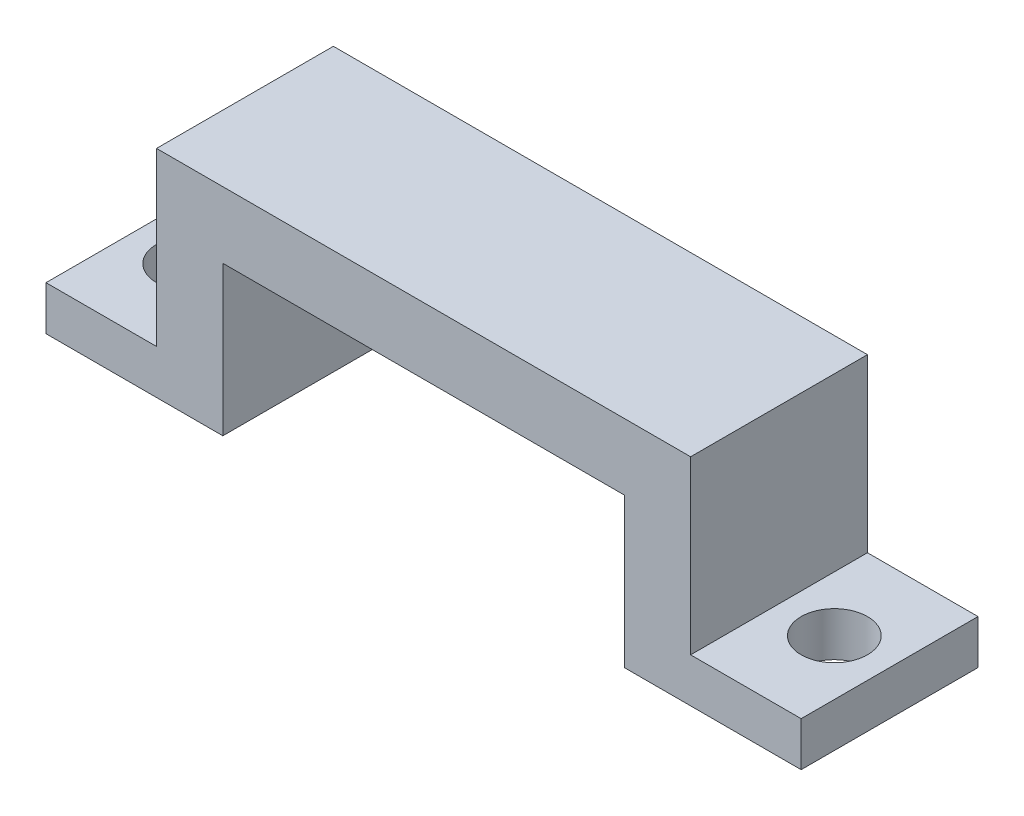
ISO-10303-21;
HEADER;
FILE_DESCRIPTION(('STEP AP214'),'2;1');
FILE_NAME('part.step','',(''),(''),'','','');
FILE_SCHEMA(('AUTOMOTIVE_DESIGN { 1 0 10303 214 1 1 1 1 }'));
ENDSEC;
DATA;
#1=APPLICATION_CONTEXT('core data for automotive mechanical design processes');
#2=APPLICATION_PROTOCOL_DEFINITION('international standard','automotive_design',2000,#1);
#3=PRODUCT_CONTEXT('',#1,'mechanical');
#4=PRODUCT('Part','Part','',(#3));
#5=PRODUCT_RELATED_PRODUCT_CATEGORY('part','',(#4));
#6=PRODUCT_DEFINITION_FORMATION('','',#4);
#7=PRODUCT_DEFINITION_CONTEXT('part definition',#1,'design');
#8=PRODUCT_DEFINITION('design','',#6,#7);
#9=PRODUCT_DEFINITION_SHAPE('','',#8);
#10=(LENGTH_UNIT() NAMED_UNIT(*) SI_UNIT(.MILLI.,.METRE.));
#11=(NAMED_UNIT(*) PLANE_ANGLE_UNIT() SI_UNIT($,.RADIAN.));
#12=(NAMED_UNIT(*) SI_UNIT($,.STERADIAN.) SOLID_ANGLE_UNIT());
#13=UNCERTAINTY_MEASURE_WITH_UNIT(LENGTH_MEASURE(1.E-05),#10,'distance_accuracy_value','');
#14=(GEOMETRIC_REPRESENTATION_CONTEXT(3) GLOBAL_UNCERTAINTY_ASSIGNED_CONTEXT((#13)) GLOBAL_UNIT_ASSIGNED_CONTEXT((#10,
#11,#12)) REPRESENTATION_CONTEXT('',''));
#15=CARTESIAN_POINT('',(0.,0.,0.));
#16=DIRECTION('',(0.,0.,1.));
#17=DIRECTION('',(1.,0.,0.));
#18=AXIS2_PLACEMENT_3D('',#15,#16,#17);
#19=CARTESIAN_POINT('',(0.,-1.38,8.));
#20=DIRECTION('',(0.,-1.,0.));
#21=DIRECTION('',(1.,0.,0.));
#22=AXIS2_PLACEMENT_3D('',#19,#20,#21);
#23=PLANE('',#22);
#24=DIRECTION('',(-1.,0.,0.));
#25=VECTOR('',#24,1.);
#26=CARTESIAN_POINT('',(0.,-1.38,0.));
#27=LINE('',#26,#25);
#28=CARTESIAN_POINT('',(-12.23,-1.38,0.));
#29=VERTEX_POINT('',#28);
#30=CARTESIAN_POINT('',(-17.23,-1.38,0.));
#31=VERTEX_POINT('',#30);
#32=EDGE_CURVE('E181',#29,#31,#27,.T.);
#33=ORIENTED_EDGE('',*,*,#32,.T.);
#34=DIRECTION('',(0.,0.,-1.));
#35=VECTOR('',#34,1.);
#36=CARTESIAN_POINT('',(-17.23,-1.38,8.));
#37=LINE('',#36,#35);
#38=CARTESIAN_POINT('',(-17.23,-1.38,8.));
#39=VERTEX_POINT('',#38);
#40=EDGE_CURVE('E202',#39,#31,#37,.T.);
#41=ORIENTED_EDGE('',*,*,#40,.F.);
#42=DIRECTION('',(-1.,0.,0.));
#43=VECTOR('',#42,1.);
#44=CARTESIAN_POINT('',(0.,-1.38,8.));
#45=LINE('',#44,#43);
#46=CARTESIAN_POINT('',(-12.23,-1.38,8.));
#47=VERTEX_POINT('',#46);
#48=EDGE_CURVE('E240',#47,#39,#45,.T.);
#49=ORIENTED_EDGE('',*,*,#48,.F.);
#50=DIRECTION('',(0.,0.,-1.));
#51=VECTOR('',#50,1.);
#52=CARTESIAN_POINT('',(-12.23,-1.38,8.));
#53=LINE('',#52,#51);
#54=EDGE_CURVE('E204',#47,#29,#53,.T.);
#55=ORIENTED_EDGE('',*,*,#54,.T.);
#56=EDGE_LOOP('',(#33,#41,#49,#55));
#57=FACE_BOUND('',#56,.T.);
#58=CARTESIAN_POINT('',(-14.73,-1.38,4.));
#59=DIRECTION('',(0.,1.,0.));
#60=DIRECTION('',(0.,0.,1.));
#61=AXIS2_PLACEMENT_3D('',#58,#59,#60);
#62=CIRCLE('',#61,1.49999999999999);
#63=CARTESIAN_POINT('',(-14.73,-1.38,5.49999999999999));
#64=VERTEX_POINT('',#63);
#65=EDGE_CURVE('E296',#64,#64,#62,.T.);
#66=ORIENTED_EDGE('',*,*,#65,.F.);
#67=EDGE_LOOP('',(#66));
#68=FACE_BOUND('',#67,.T.);
#69=ADVANCED_FACE('F41',(#57,#68),#23,.F.);
#70=CARTESIAN_POINT('',(0.,-3.38,8.));
#71=DIRECTION('',(0.,-1.,0.));
#72=DIRECTION('',(0.,0.,-1.));
#73=AXIS2_PLACEMENT_3D('',#70,#71,#72);
#74=PLANE('',#73);
#75=DIRECTION('',(-1.,0.,0.));
#76=VECTOR('',#75,1.);
#77=CARTESIAN_POINT('',(0.,-3.38,0.));
#78=LINE('',#77,#76);
#79=CARTESIAN_POINT('',(-9.23,-3.38,0.));
#80=VERTEX_POINT('',#79);
#81=CARTESIAN_POINT('',(-17.23,-3.38,0.));
#82=VERTEX_POINT('',#81);
#83=EDGE_CURVE('E187',#80,#82,#78,.T.);
#84=ORIENTED_EDGE('',*,*,#83,.F.);
#85=DIRECTION('',(0.,0.,-1.));
#86=VECTOR('',#85,1.);
#87=CARTESIAN_POINT('',(-9.23,-3.38,8.));
#88=LINE('',#87,#86);
#89=CARTESIAN_POINT('',(-9.23,-3.38,8.));
#90=VERTEX_POINT('',#89);
#91=EDGE_CURVE('E155',#90,#80,#88,.T.);
#92=ORIENTED_EDGE('',*,*,#91,.F.);
#93=DIRECTION('',(-1.,0.,0.));
#94=VECTOR('',#93,1.);
#95=CARTESIAN_POINT('',(0.,-3.38,8.));
#96=LINE('',#95,#94);
#97=CARTESIAN_POINT('',(-17.23,-3.38,8.));
#98=VERTEX_POINT('',#97);
#99=EDGE_CURVE('E145',#90,#98,#96,.T.);
#100=ORIENTED_EDGE('',*,*,#99,.T.);
#101=DIRECTION('',(0.,0.,-1.));
#102=VECTOR('',#101,1.);
#103=CARTESIAN_POINT('',(-17.23,-3.38,8.));
#104=LINE('',#103,#102);
#105=EDGE_CURVE('E200',#98,#82,#104,.T.);
#106=ORIENTED_EDGE('',*,*,#105,.T.);
#107=EDGE_LOOP('',(#84,#92,#100,#106));
#108=FACE_BOUND('',#107,.T.);
#109=CARTESIAN_POINT('',(-14.73,-3.38,4.));
#110=DIRECTION('',(0.,1.,0.));
#111=DIRECTION('',(0.,0.,1.));
#112=AXIS2_PLACEMENT_3D('',#109,#110,#111);
#113=CIRCLE('',#112,1.5);
#114=CARTESIAN_POINT('',(-14.73,-3.38,5.5));
#115=VERTEX_POINT('',#114);
#116=EDGE_CURVE('E166',#115,#115,#113,.T.);
#117=ORIENTED_EDGE('',*,*,#116,.T.);
#118=EDGE_LOOP('',(#117));
#119=FACE_BOUND('',#118,.T.);
#120=ADVANCED_FACE('F246',(#108,#119),#74,.T.);
#121=CARTESIAN_POINT('',(0.,-3.38000000000001,8.));
#122=DIRECTION('',(0.,1.,0.));
#123=DIRECTION('',(-1.,0.,0.));
#124=AXIS2_PLACEMENT_3D('',#121,#122,#123);
#125=PLANE('',#124);
#126=CARTESIAN_POINT('',(14.43,-3.38,4.));
#127=DIRECTION('',(0.,1.,0.));
#128=DIRECTION('',(0.,0.,1.));
#129=AXIS2_PLACEMENT_3D('',#126,#127,#128);
#130=CIRCLE('',#129,1.5);
#131=CARTESIAN_POINT('',(14.43,-3.38,5.5));
#132=VERTEX_POINT('',#131);
#133=EDGE_CURVE('E292',#132,#132,#130,.T.);
#134=ORIENTED_EDGE('',*,*,#133,.T.);
#135=EDGE_LOOP('',(#134));
#136=FACE_BOUND('',#135,.T.);
#137=DIRECTION('',(1.,0.,0.));
#138=VECTOR('',#137,1.);
#139=CARTESIAN_POINT('',(0.,-3.38000000000001,0.));
#140=LINE('',#139,#138);
#141=CARTESIAN_POINT('',(8.93,-3.38,0.));
#142=VERTEX_POINT('',#141);
#143=CARTESIAN_POINT('',(16.93,-3.38,0.));
#144=VERTEX_POINT('',#143);
#145=EDGE_CURVE('E163',#142,#144,#140,.T.);
#146=ORIENTED_EDGE('',*,*,#145,.T.);
#147=DIRECTION('',(0.,0.,-1.));
#148=VECTOR('',#147,1.);
#149=CARTESIAN_POINT('',(16.93,-3.38,8.));
#150=LINE('',#149,#148);
#151=CARTESIAN_POINT('',(16.93,-3.38,8.));
#152=VERTEX_POINT('',#151);
#153=EDGE_CURVE('E11',#152,#144,#150,.T.);
#154=ORIENTED_EDGE('',*,*,#153,.F.);
#155=DIRECTION('',(1.,0.,0.));
#156=VECTOR('',#155,1.);
#157=CARTESIAN_POINT('',(0.,-3.38000000000001,8.));
#158=LINE('',#157,#156);
#159=CARTESIAN_POINT('',(8.93,-3.38,8.));
#160=VERTEX_POINT('',#159);
#161=EDGE_CURVE('E196',#160,#152,#158,.T.);
#162=ORIENTED_EDGE('',*,*,#161,.F.);
#163=DIRECTION('',(0.,0.,-1.));
#164=VECTOR('',#163,1.);
#165=CARTESIAN_POINT('',(8.93,-3.38,8.));
#166=LINE('',#165,#164);
#167=EDGE_CURVE('E58',#160,#142,#166,.T.);
#168=ORIENTED_EDGE('',*,*,#167,.T.);
#169=EDGE_LOOP('',(#146,#154,#162,#168));
#170=FACE_BOUND('',#169,.T.);
#171=ADVANCED_FACE('F43',(#136,#170),#125,.F.);
#172=CARTESIAN_POINT('',(16.93,0.,8.));
#173=DIRECTION('',(-1.,0.,0.));
#174=DIRECTION('',(0.,0.,1.));
#175=AXIS2_PLACEMENT_3D('',#172,#173,#174);
#176=PLANE('',#175);
#177=DIRECTION('',(0.,1.,0.));
#178=VECTOR('',#177,1.);
#179=CARTESIAN_POINT('',(16.93,0.,0.));
#180=LINE('',#179,#178);
#181=CARTESIAN_POINT('',(16.93,-1.38,0.));
#182=VERTEX_POINT('',#181);
#183=EDGE_CURVE('E165',#144,#182,#180,.T.);
#184=ORIENTED_EDGE('',*,*,#183,.T.);
#185=DIRECTION('',(0.,0.,-1.));
#186=VECTOR('',#185,1.);
#187=CARTESIAN_POINT('',(16.93,-1.38,8.));
#188=LINE('',#187,#186);
#189=CARTESIAN_POINT('',(16.93,-1.38,8.));
#190=VERTEX_POINT('',#189);
#191=EDGE_CURVE('E50',#190,#182,#188,.T.);
#192=ORIENTED_EDGE('',*,*,#191,.F.);
#193=DIRECTION('',(0.,1.,0.));
#194=VECTOR('',#193,1.);
#195=CARTESIAN_POINT('',(16.93,0.,8.));
#196=LINE('',#195,#194);
#197=EDGE_CURVE('E109',#152,#190,#196,.T.);
#198=ORIENTED_EDGE('',*,*,#197,.F.);
#199=ORIENTED_EDGE('',*,*,#153,.T.);
#200=EDGE_LOOP('',(#184,#192,#198,#199));
#201=FACE_BOUND('',#200,.T.);
#202=ADVANCED_FACE('F217',(#201),#176,.F.);
#203=CARTESIAN_POINT('',(0.,-1.38,8.));
#204=DIRECTION('',(0.,1.,0.));
#205=DIRECTION('',(-1.,0.,0.));
#206=AXIS2_PLACEMENT_3D('',#203,#204,#205);
#207=PLANE('',#206);
#208=CARTESIAN_POINT('',(14.43,-1.38,4.));
#209=DIRECTION('',(0.,1.,0.));
#210=DIRECTION('',(0.,0.,1.));
#211=AXIS2_PLACEMENT_3D('',#208,#209,#210);
#212=CIRCLE('',#211,1.49999999999999);
#213=CARTESIAN_POINT('',(14.43,-1.38,5.49999999999999));
#214=VERTEX_POINT('',#213);
#215=EDGE_CURVE('E300',#214,#214,#212,.T.);
#216=ORIENTED_EDGE('',*,*,#215,.F.);
#217=EDGE_LOOP('',(#216));
#218=FACE_BOUND('',#217,.T.);
#219=DIRECTION('',(1.,0.,0.));
#220=VECTOR('',#219,1.);
#221=CARTESIAN_POINT('',(0.,-1.38,0.));
#222=LINE('',#221,#220);
#223=CARTESIAN_POINT('',(11.93,-1.38,0.));
#224=VERTEX_POINT('',#223);
#225=EDGE_CURVE('E169',#224,#182,#222,.T.);
#226=ORIENTED_EDGE('',*,*,#225,.F.);
#227=DIRECTION('',(0.,0.,-1.));
#228=VECTOR('',#227,1.);
#229=CARTESIAN_POINT('',(11.93,-1.38,8.));
#230=LINE('',#229,#228);
#231=CARTESIAN_POINT('',(11.93,-1.38,8.));
#232=VERTEX_POINT('',#231);
#233=EDGE_CURVE('E210',#232,#224,#230,.T.);
#234=ORIENTED_EDGE('',*,*,#233,.F.);
#235=DIRECTION('',(1.,0.,0.));
#236=VECTOR('',#235,1.);
#237=CARTESIAN_POINT('',(0.,-1.38,8.));
#238=LINE('',#237,#236);
#239=EDGE_CURVE('E216',#232,#190,#238,.T.);
#240=ORIENTED_EDGE('',*,*,#239,.T.);
#241=ORIENTED_EDGE('',*,*,#191,.T.);
#242=EDGE_LOOP('',(#226,#234,#240,#241));
#243=FACE_BOUND('',#242,.T.);
#244=ADVANCED_FACE('F214',(#218,#243),#207,.T.);
#245=CARTESIAN_POINT('',(11.93,0.,8.));
#246=DIRECTION('',(-1.,0.,0.));
#247=DIRECTION('',(0.,-1.,0.));
#248=AXIS2_PLACEMENT_3D('',#245,#246,#247);
#249=PLANE('',#248);
#250=DIRECTION('',(0.,1.,0.));
#251=VECTOR('',#250,1.);
#252=CARTESIAN_POINT('',(11.93,0.,0.));
#253=LINE('',#252,#251);
#254=CARTESIAN_POINT('',(11.93,6.38,0.));
#255=VERTEX_POINT('',#254);
#256=EDGE_CURVE('E172',#224,#255,#253,.T.);
#257=ORIENTED_EDGE('',*,*,#256,.T.);
#258=DIRECTION('',(0.,0.,-1.));
#259=VECTOR('',#258,1.);
#260=CARTESIAN_POINT('',(11.93,6.38,8.));
#261=LINE('',#260,#259);
#262=CARTESIAN_POINT('',(11.93,6.38,8.));
#263=VERTEX_POINT('',#262);
#264=EDGE_CURVE('E208',#263,#255,#261,.T.);
#265=ORIENTED_EDGE('',*,*,#264,.F.);
#266=DIRECTION('',(0.,1.,0.));
#267=VECTOR('',#266,1.);
#268=CARTESIAN_POINT('',(11.93,0.,8.));
#269=LINE('',#268,#267);
#270=EDGE_CURVE('E228',#232,#263,#269,.T.);
#271=ORIENTED_EDGE('',*,*,#270,.F.);
#272=ORIENTED_EDGE('',*,*,#233,.T.);
#273=EDGE_LOOP('',(#257,#265,#271,#272));
#274=FACE_BOUND('',#273,.T.);
#275=ADVANCED_FACE('F225',(#274),#249,.F.);
#276=CARTESIAN_POINT('',(0.,6.38,8.));
#277=DIRECTION('',(0.,1.,0.));
#278=DIRECTION('',(0.,0.,1.));
#279=AXIS2_PLACEMENT_3D('',#276,#277,#278);
#280=PLANE('',#279);
#281=DIRECTION('',(1.,0.,0.));
#282=VECTOR('',#281,1.);
#283=CARTESIAN_POINT('',(0.,6.38,0.));
#284=LINE('',#283,#282);
#285=CARTESIAN_POINT('',(-12.23,6.38,0.));
#286=VERTEX_POINT('',#285);
#287=EDGE_CURVE('E175',#286,#255,#284,.T.);
#288=ORIENTED_EDGE('',*,*,#287,.F.);
#289=DIRECTION('',(0.,0.,-1.));
#290=VECTOR('',#289,1.);
#291=CARTESIAN_POINT('',(-12.23,6.38,8.));
#292=LINE('',#291,#290);
#293=CARTESIAN_POINT('',(-12.23,6.38,8.));
#294=VERTEX_POINT('',#293);
#295=EDGE_CURVE('E206',#294,#286,#292,.T.);
#296=ORIENTED_EDGE('',*,*,#295,.F.);
#297=DIRECTION('',(1.,0.,0.));
#298=VECTOR('',#297,1.);
#299=CARTESIAN_POINT('',(0.,6.38,8.));
#300=LINE('',#299,#298);
#301=EDGE_CURVE('E230',#294,#263,#300,.T.);
#302=ORIENTED_EDGE('',*,*,#301,.T.);
#303=ORIENTED_EDGE('',*,*,#264,.T.);
#304=EDGE_LOOP('',(#288,#296,#302,#303));
#305=FACE_BOUND('',#304,.T.);
#306=ADVANCED_FACE('F274',(#305),#280,.T.);
#307=CARTESIAN_POINT('',(-12.23,0.,8.));
#308=DIRECTION('',(-1.,0.,0.));
#309=DIRECTION('',(0.,-1.,0.));
#310=AXIS2_PLACEMENT_3D('',#307,#308,#309);
#311=PLANE('',#310);
#312=DIRECTION('',(0.,1.,0.));
#313=VECTOR('',#312,1.);
#314=CARTESIAN_POINT('',(-12.23,0.,0.));
#315=LINE('',#314,#313);
#316=EDGE_CURVE('E178',#29,#286,#315,.T.);
#317=ORIENTED_EDGE('',*,*,#316,.F.);
#318=ORIENTED_EDGE('',*,*,#54,.F.);
#319=DIRECTION('',(0.,1.,0.));
#320=VECTOR('',#319,1.);
#321=CARTESIAN_POINT('',(-12.23,0.,8.));
#322=LINE('',#321,#320);
#323=EDGE_CURVE('E237',#47,#294,#322,.T.);
#324=ORIENTED_EDGE('',*,*,#323,.T.);
#325=ORIENTED_EDGE('',*,*,#295,.T.);
#326=EDGE_LOOP('',(#317,#318,#324,#325));
#327=FACE_BOUND('',#326,.T.);
#328=ADVANCED_FACE('F271',(#327),#311,.T.);
#329=CARTESIAN_POINT('',(-17.23,0.,8.));
#330=DIRECTION('',(-1.,0.,0.));
#331=DIRECTION('',(0.,0.,1.));
#332=AXIS2_PLACEMENT_3D('',#329,#330,#331);
#333=PLANE('',#332);
#334=DIRECTION('',(0.,1.,0.));
#335=VECTOR('',#334,1.);
#336=CARTESIAN_POINT('',(-17.23,0.,0.));
#337=LINE('',#336,#335);
#338=EDGE_CURVE('E184',#82,#31,#337,.T.);
#339=ORIENTED_EDGE('',*,*,#338,.F.);
#340=ORIENTED_EDGE('',*,*,#105,.F.);
#341=DIRECTION('',(0.,1.,0.));
#342=VECTOR('',#341,1.);
#343=CARTESIAN_POINT('',(-17.23,0.,8.));
#344=LINE('',#343,#342);
#345=EDGE_CURVE('E242',#98,#39,#344,.T.);
#346=ORIENTED_EDGE('',*,*,#345,.T.);
#347=ORIENTED_EDGE('',*,*,#40,.T.);
#348=EDGE_LOOP('',(#339,#340,#346,#347));
#349=FACE_BOUND('',#348,.T.);
#350=ADVANCED_FACE('F270',(#349),#333,.T.);
#351=CARTESIAN_POINT('',(-9.23,0.,8.));
#352=DIRECTION('',(-1.,0.,0.));
#353=DIRECTION('',(0.,0.,1.));
#354=AXIS2_PLACEMENT_3D('',#351,#352,#353);
#355=PLANE('',#354);
#356=DIRECTION('',(0.,1.,0.));
#357=VECTOR('',#356,1.);
#358=CARTESIAN_POINT('',(-9.23,0.,0.));
#359=LINE('',#358,#357);
#360=CARTESIAN_POINT('',(-9.23,3.38,0.));
#361=VERTEX_POINT('',#360);
#362=EDGE_CURVE('E152',#80,#361,#359,.T.);
#363=ORIENTED_EDGE('',*,*,#362,.T.);
#364=DIRECTION('',(0.,0.,-1.));
#365=VECTOR('',#364,1.);
#366=CARTESIAN_POINT('',(-9.23,3.38,8.));
#367=LINE('',#366,#365);
#368=CARTESIAN_POINT('',(-9.23,3.38,8.));
#369=VERTEX_POINT('',#368);
#370=EDGE_CURVE('E149',#369,#361,#367,.T.);
#371=ORIENTED_EDGE('',*,*,#370,.F.);
#372=DIRECTION('',(0.,1.,0.));
#373=VECTOR('',#372,1.);
#374=CARTESIAN_POINT('',(-9.23,0.,8.));
#375=LINE('',#374,#373);
#376=EDGE_CURVE('E137',#90,#369,#375,.T.);
#377=ORIENTED_EDGE('',*,*,#376,.F.);
#378=ORIENTED_EDGE('',*,*,#91,.T.);
#379=EDGE_LOOP('',(#363,#371,#377,#378));
#380=FACE_BOUND('',#379,.T.);
#381=ADVANCED_FACE('F150',(#380),#355,.F.);
#382=CARTESIAN_POINT('',(0.,3.38,8.));
#383=DIRECTION('',(0.,1.,0.));
#384=DIRECTION('',(0.,0.,1.));
#385=AXIS2_PLACEMENT_3D('',#382,#383,#384);
#386=PLANE('',#385);
#387=DIRECTION('',(1.,0.,0.));
#388=VECTOR('',#387,1.);
#389=CARTESIAN_POINT('',(0.,3.38,0.));
#390=LINE('',#389,#388);
#391=CARTESIAN_POINT('',(8.93,3.38,0.));
#392=VERTEX_POINT('',#391);
#393=EDGE_CURVE('E191',#361,#392,#390,.T.);
#394=ORIENTED_EDGE('',*,*,#393,.T.);
#395=DIRECTION('',(0.,0.,-1.));
#396=VECTOR('',#395,1.);
#397=CARTESIAN_POINT('',(8.93,3.38,8.));
#398=LINE('',#397,#396);
#399=CARTESIAN_POINT('',(8.93,3.38,8.));
#400=VERTEX_POINT('',#399);
#401=EDGE_CURVE('E97',#400,#392,#398,.T.);
#402=ORIENTED_EDGE('',*,*,#401,.F.);
#403=DIRECTION('',(1.,0.,0.));
#404=VECTOR('',#403,1.);
#405=CARTESIAN_POINT('',(0.,3.38,8.));
#406=LINE('',#405,#404);
#407=EDGE_CURVE('E142',#369,#400,#406,.T.);
#408=ORIENTED_EDGE('',*,*,#407,.F.);
#409=ORIENTED_EDGE('',*,*,#370,.T.);
#410=EDGE_LOOP('',(#394,#402,#408,#409));
#411=FACE_BOUND('',#410,.T.);
#412=ADVANCED_FACE('F157',(#411),#386,.F.);
#413=CARTESIAN_POINT('',(8.93,0.,8.));
#414=DIRECTION('',(-1.,0.,0.));
#415=DIRECTION('',(0.,0.,1.));
#416=AXIS2_PLACEMENT_3D('',#413,#414,#415);
#417=PLANE('',#416);
#418=DIRECTION('',(0.,1.,0.));
#419=VECTOR('',#418,1.);
#420=CARTESIAN_POINT('',(8.93,0.,0.));
#421=LINE('',#420,#419);
#422=EDGE_CURVE('E193',#142,#392,#421,.T.);
#423=ORIENTED_EDGE('',*,*,#422,.F.);
#424=ORIENTED_EDGE('',*,*,#167,.F.);
#425=DIRECTION('',(0.,1.,0.));
#426=VECTOR('',#425,1.);
#427=CARTESIAN_POINT('',(8.93,0.,8.));
#428=LINE('',#427,#426);
#429=EDGE_CURVE('E158',#160,#400,#428,.T.);
#430=ORIENTED_EDGE('',*,*,#429,.T.);
#431=ORIENTED_EDGE('',*,*,#401,.T.);
#432=EDGE_LOOP('',(#423,#424,#430,#431));
#433=FACE_BOUND('',#432,.T.);
#434=ADVANCED_FACE('F249',(#433),#417,.T.);
#435=CARTESIAN_POINT('',(0.,0.,8.));
#436=DIRECTION('',(0.,0.,1.));
#437=DIRECTION('',(1.,0.,0.));
#438=AXIS2_PLACEMENT_3D('',#435,#436,#437);
#439=PLANE('',#438);
#440=ORIENTED_EDGE('',*,*,#161,.T.);
#441=ORIENTED_EDGE('',*,*,#197,.T.);
#442=ORIENTED_EDGE('',*,*,#239,.F.);
#443=ORIENTED_EDGE('',*,*,#270,.T.);
#444=ORIENTED_EDGE('',*,*,#301,.F.);
#445=ORIENTED_EDGE('',*,*,#323,.F.);
#446=ORIENTED_EDGE('',*,*,#48,.T.);
#447=ORIENTED_EDGE('',*,*,#345,.F.);
#448=ORIENTED_EDGE('',*,*,#99,.F.);
#449=ORIENTED_EDGE('',*,*,#376,.T.);
#450=ORIENTED_EDGE('',*,*,#407,.T.);
#451=ORIENTED_EDGE('',*,*,#429,.F.);
#452=EDGE_LOOP('',(#440,#441,#442,#443,#444,#445,#446,#447,#448,#449,#450,#451));
#453=FACE_BOUND('',#452,.T.);
#454=ADVANCED_FACE('F139',(#453),#439,.T.);
#455=CARTESIAN_POINT('',(0.,0.,0.));
#456=DIRECTION('',(0.,0.,1.));
#457=DIRECTION('',(1.,0.,0.));
#458=AXIS2_PLACEMENT_3D('',#455,#456,#457);
#459=PLANE('',#458);
#460=ORIENTED_EDGE('',*,*,#145,.F.);
#461=ORIENTED_EDGE('',*,*,#422,.T.);
#462=ORIENTED_EDGE('',*,*,#393,.F.);
#463=ORIENTED_EDGE('',*,*,#362,.F.);
#464=ORIENTED_EDGE('',*,*,#83,.T.);
#465=ORIENTED_EDGE('',*,*,#338,.T.);
#466=ORIENTED_EDGE('',*,*,#32,.F.);
#467=ORIENTED_EDGE('',*,*,#316,.T.);
#468=ORIENTED_EDGE('',*,*,#287,.T.);
#469=ORIENTED_EDGE('',*,*,#256,.F.);
#470=ORIENTED_EDGE('',*,*,#225,.T.);
#471=ORIENTED_EDGE('',*,*,#183,.F.);
#472=EDGE_LOOP('',(#460,#461,#462,#463,#464,#465,#466,#467,#468,#469,#470,#471));
#473=FACE_BOUND('',#472,.T.);
#474=ADVANCED_FACE('F221',(#473),#459,.F.);
#475=CARTESIAN_POINT('',(-14.73,-1.38,4.));
#476=DIRECTION('',(0.,1.,0.));
#477=DIRECTION('',(0.,0.,1.));
#478=AXIS2_PLACEMENT_3D('',#475,#476,#477);
#479=CYLINDRICAL_SURFACE('',#478,1.49999999999999);
#480=ORIENTED_EDGE('',*,*,#116,.F.);
#481=EDGE_LOOP('',(#480));
#482=FACE_BOUND('',#481,.T.);
#483=ORIENTED_EDGE('',*,*,#65,.T.);
#484=EDGE_LOOP('',(#483));
#485=FACE_BOUND('',#484,.T.);
#486=ADVANCED_FACE('F306',(#482,#485),#479,.F.);
#487=CARTESIAN_POINT('',(14.43,-1.38,4.));
#488=DIRECTION('',(0.,1.,0.));
#489=DIRECTION('',(0.,0.,1.));
#490=AXIS2_PLACEMENT_3D('',#487,#488,#489);
#491=CYLINDRICAL_SURFACE('',#490,1.49999999999999);
#492=ORIENTED_EDGE('',*,*,#133,.F.);
#493=EDGE_LOOP('',(#492));
#494=FACE_BOUND('',#493,.T.);
#495=ORIENTED_EDGE('',*,*,#215,.T.);
#496=EDGE_LOOP('',(#495));
#497=FACE_BOUND('',#496,.T.);
#498=ADVANCED_FACE('F304',(#494,#497),#491,.F.);
#499=CLOSED_SHELL('',(#69,#120,#171,#202,#244,#275,#306,#328,#350,#381,#412,#434,#454,#474,#486,#498));
#500=MANIFOLD_SOLID_BREP('B2',#499);
#501=ADVANCED_BREP_SHAPE_REPRESENTATION('',(#18,#500),#14);
#502=SHAPE_DEFINITION_REPRESENTATION(#9,#501);
ENDSEC;
END-ISO-10303-21;
